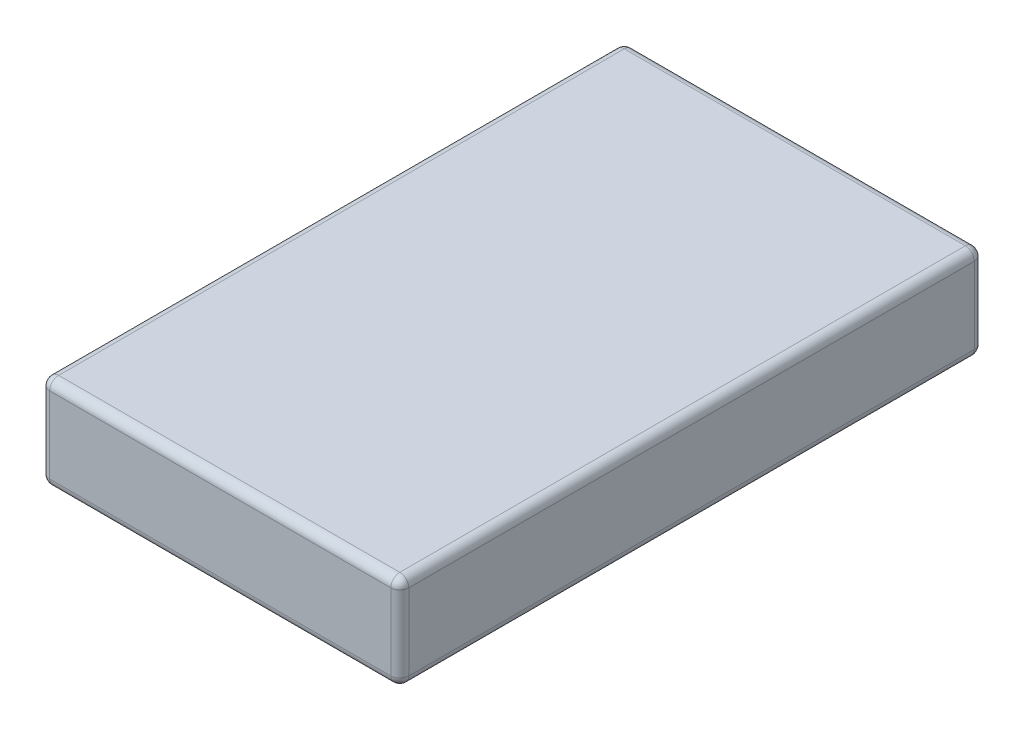
ISO-10303-21;
HEADER;
FILE_DESCRIPTION(('STEP AP214'),'2;1');
FILE_NAME('part.step','',(''),(''),'','','');
FILE_SCHEMA(('AUTOMOTIVE_DESIGN { 1 0 10303 214 1 1 1 1 }'));
ENDSEC;
DATA;
#1=APPLICATION_CONTEXT('core data for automotive mechanical design processes');
#2=APPLICATION_PROTOCOL_DEFINITION('international standard','automotive_design',2000,#1);
#3=PRODUCT_CONTEXT('',#1,'mechanical');
#4=PRODUCT('Part','Part','',(#3));
#5=PRODUCT_RELATED_PRODUCT_CATEGORY('part','',(#4));
#6=PRODUCT_DEFINITION_FORMATION('','',#4);
#7=PRODUCT_DEFINITION_CONTEXT('part definition',#1,'design');
#8=PRODUCT_DEFINITION('design','',#6,#7);
#9=PRODUCT_DEFINITION_SHAPE('','',#8);
#10=(LENGTH_UNIT() NAMED_UNIT(*) SI_UNIT(.MILLI.,.METRE.));
#11=(NAMED_UNIT(*) PLANE_ANGLE_UNIT() SI_UNIT($,.RADIAN.));
#12=(NAMED_UNIT(*) SI_UNIT($,.STERADIAN.) SOLID_ANGLE_UNIT());
#13=UNCERTAINTY_MEASURE_WITH_UNIT(LENGTH_MEASURE(1.E-05),#10,'distance_accuracy_value','');
#14=(GEOMETRIC_REPRESENTATION_CONTEXT(3) GLOBAL_UNCERTAINTY_ASSIGNED_CONTEXT((#13)) GLOBAL_UNIT_ASSIGNED_CONTEXT((#10,
#11,#12)) REPRESENTATION_CONTEXT('',''));
#15=CARTESIAN_POINT('',(0.,0.,0.));
#16=DIRECTION('',(0.,0.,1.));
#17=DIRECTION('',(1.,0.,0.));
#18=AXIS2_PLACEMENT_3D('',#15,#16,#17);
#19=CARTESIAN_POINT('',(1016.,533.4,-1651.));
#20=DIRECTION('',(-1.,0.,0.));
#21=DIRECTION('',(0.,0.,1.));
#22=AXIS2_PLACEMENT_3D('',#19,#20,#21);
#23=PLANE('',#22);
#24=DIRECTION('',(0.,-1.,0.));
#25=VECTOR('',#24,1.);
#26=CARTESIAN_POINT('',(1016.,533.4,1600.2));
#27=LINE('',#26,#25);
#28=CARTESIAN_POINT('',(1016.,482.6,1600.2));
#29=VERTEX_POINT('',#28);
#30=CARTESIAN_POINT('',(1016.,50.8,1600.2));
#31=VERTEX_POINT('',#30);
#32=EDGE_CURVE('E200',#29,#31,#27,.T.);
#33=ORIENTED_EDGE('',*,*,#32,.T.);
#34=DIRECTION('',(0.,0.,-1.));
#35=VECTOR('',#34,1.);
#36=CARTESIAN_POINT('',(1016.,50.8,-1651.));
#37=LINE('',#36,#35);
#38=CARTESIAN_POINT('',(1016.,50.8,-1600.2));
#39=VERTEX_POINT('',#38);
#40=EDGE_CURVE('E207',#31,#39,#37,.T.);
#41=ORIENTED_EDGE('',*,*,#40,.T.);
#42=DIRECTION('',(0.,-1.,0.));
#43=VECTOR('',#42,1.);
#44=CARTESIAN_POINT('',(1016.,533.4,-1600.2));
#45=LINE('',#44,#43);
#46=CARTESIAN_POINT('',(1016.,482.6,-1600.2));
#47=VERTEX_POINT('',#46);
#48=EDGE_CURVE('E203',#39,#47,#45,.F.);
#49=ORIENTED_EDGE('',*,*,#48,.T.);
#50=DIRECTION('',(0.,0.,-1.));
#51=VECTOR('',#50,1.);
#52=CARTESIAN_POINT('',(1016.,482.6,1651.));
#53=LINE('',#52,#51);
#54=EDGE_CURVE('E197',#47,#29,#53,.F.);
#55=ORIENTED_EDGE('',*,*,#54,.T.);
#56=EDGE_LOOP('',(#33,#41,#49,#55));
#57=FACE_BOUND('',#56,.T.);
#58=ADVANCED_FACE('F45',(#57),#23,.F.);
#59=CARTESIAN_POINT('',(-1016.,533.4,-1651.));
#60=DIRECTION('',(0.,0.,1.));
#61=DIRECTION('',(1.,0.,0.));
#62=AXIS2_PLACEMENT_3D('',#59,#60,#61);
#63=PLANE('',#62);
#64=DIRECTION('',(0.,-1.,0.));
#65=VECTOR('',#64,1.);
#66=CARTESIAN_POINT('',(965.2,533.4,-1651.));
#67=LINE('',#66,#65);
#68=CARTESIAN_POINT('',(965.2,482.6,-1651.));
#69=VERTEX_POINT('',#68);
#70=CARTESIAN_POINT('',(965.2,50.8,-1651.));
#71=VERTEX_POINT('',#70);
#72=EDGE_CURVE('E187',#69,#71,#67,.T.);
#73=ORIENTED_EDGE('',*,*,#72,.T.);
#74=DIRECTION('',(-1.,0.,0.));
#75=VECTOR('',#74,1.);
#76=CARTESIAN_POINT('',(-1016.,50.8,-1651.));
#77=LINE('',#76,#75);
#78=CARTESIAN_POINT('',(-965.2,50.8,-1651.));
#79=VERTEX_POINT('',#78);
#80=EDGE_CURVE('E194',#71,#79,#77,.T.);
#81=ORIENTED_EDGE('',*,*,#80,.T.);
#82=DIRECTION('',(0.,-1.,0.));
#83=VECTOR('',#82,1.);
#84=CARTESIAN_POINT('',(-965.2,533.4,-1651.));
#85=LINE('',#84,#83);
#86=CARTESIAN_POINT('',(-965.2,482.6,-1651.));
#87=VERTEX_POINT('',#86);
#88=EDGE_CURVE('E190',#79,#87,#85,.F.);
#89=ORIENTED_EDGE('',*,*,#88,.T.);
#90=DIRECTION('',(-1.,0.,0.));
#91=VECTOR('',#90,1.);
#92=CARTESIAN_POINT('',(1016.,482.6,-1651.));
#93=LINE('',#92,#91);
#94=EDGE_CURVE('E184',#87,#69,#93,.F.);
#95=ORIENTED_EDGE('',*,*,#94,.T.);
#96=EDGE_LOOP('',(#73,#81,#89,#95));
#97=FACE_BOUND('',#96,.T.);
#98=ADVANCED_FACE('F364',(#97),#63,.F.);
#99=CARTESIAN_POINT('',(-1016.,533.4,-1651.));
#100=DIRECTION('',(1.,0.,0.));
#101=DIRECTION('',(0.,0.,-1.));
#102=AXIS2_PLACEMENT_3D('',#99,#100,#101);
#103=PLANE('',#102);
#104=DIRECTION('',(0.,-1.,0.));
#105=VECTOR('',#104,1.);
#106=CARTESIAN_POINT('',(-1016.,533.4,-1600.2));
#107=LINE('',#106,#105);
#108=CARTESIAN_POINT('',(-1016.,482.6,-1600.2));
#109=VERTEX_POINT('',#108);
#110=CARTESIAN_POINT('',(-1016.,50.8,-1600.2));
#111=VERTEX_POINT('',#110);
#112=EDGE_CURVE('E146',#109,#111,#107,.T.);
#113=ORIENTED_EDGE('',*,*,#112,.T.);
#114=DIRECTION('',(0.,0.,1.));
#115=VECTOR('',#114,1.);
#116=CARTESIAN_POINT('',(-1016.,50.8,-1651.));
#117=LINE('',#116,#115);
#118=CARTESIAN_POINT('',(-1016.,50.8,1600.2));
#119=VERTEX_POINT('',#118);
#120=EDGE_CURVE('E141',#111,#119,#117,.T.);
#121=ORIENTED_EDGE('',*,*,#120,.T.);
#122=DIRECTION('',(0.,-1.,0.));
#123=VECTOR('',#122,1.);
#124=CARTESIAN_POINT('',(-1016.,533.4,1600.2));
#125=LINE('',#124,#123);
#126=CARTESIAN_POINT('',(-1016.,482.6,1600.2));
#127=VERTEX_POINT('',#126);
#128=EDGE_CURVE('E133',#119,#127,#125,.F.);
#129=ORIENTED_EDGE('',*,*,#128,.T.);
#130=DIRECTION('',(0.,0.,1.));
#131=VECTOR('',#130,1.);
#132=CARTESIAN_POINT('',(-1016.,482.6,-1651.));
#133=LINE('',#132,#131);
#134=EDGE_CURVE('E138',#127,#109,#133,.F.);
#135=ORIENTED_EDGE('',*,*,#134,.T.);
#136=EDGE_LOOP('',(#113,#121,#129,#135));
#137=FACE_BOUND('',#136,.T.);
#138=ADVANCED_FACE('F136',(#137),#103,.F.);
#139=CARTESIAN_POINT('',(-1016.,533.4,1651.));
#140=DIRECTION('',(0.,0.,-1.));
#141=DIRECTION('',(-1.,0.,0.));
#142=AXIS2_PLACEMENT_3D('',#139,#140,#141);
#143=PLANE('',#142);
#144=DIRECTION('',(0.,-1.,0.));
#145=VECTOR('',#144,1.);
#146=CARTESIAN_POINT('',(-965.2,533.4,1651.));
#147=LINE('',#146,#145);
#148=CARTESIAN_POINT('',(-965.2,482.6,1651.));
#149=VERTEX_POINT('',#148);
#150=CARTESIAN_POINT('',(-965.2,50.8,1651.));
#151=VERTEX_POINT('',#150);
#152=EDGE_CURVE('E154',#149,#151,#147,.T.);
#153=ORIENTED_EDGE('',*,*,#152,.T.);
#154=DIRECTION('',(1.,0.,0.));
#155=VECTOR('',#154,1.);
#156=CARTESIAN_POINT('',(-1016.,50.8,1651.));
#157=LINE('',#156,#155);
#158=CARTESIAN_POINT('',(965.2,50.8,1651.));
#159=VERTEX_POINT('',#158);
#160=EDGE_CURVE('E218',#151,#159,#157,.T.);
#161=ORIENTED_EDGE('',*,*,#160,.T.);
#162=DIRECTION('',(0.,-1.,0.));
#163=VECTOR('',#162,1.);
#164=CARTESIAN_POINT('',(965.2,533.4,1651.));
#165=LINE('',#164,#163);
#166=CARTESIAN_POINT('',(965.2,482.6,1651.));
#167=VERTEX_POINT('',#166);
#168=EDGE_CURVE('E213',#159,#167,#165,.F.);
#169=ORIENTED_EDGE('',*,*,#168,.T.);
#170=DIRECTION('',(1.,0.,0.));
#171=VECTOR('',#170,1.);
#172=CARTESIAN_POINT('',(-1016.,482.6,1651.));
#173=LINE('',#172,#171);
#174=EDGE_CURVE('E210',#167,#149,#173,.F.);
#175=ORIENTED_EDGE('',*,*,#174,.T.);
#176=EDGE_LOOP('',(#153,#161,#169,#175));
#177=FACE_BOUND('',#176,.T.);
#178=ADVANCED_FACE('F355',(#177),#143,.F.);
#179=CARTESIAN_POINT('',(0.,533.4,0.));
#180=DIRECTION('',(0.,1.,0.));
#181=DIRECTION('',(0.,0.,1.));
#182=AXIS2_PLACEMENT_3D('',#179,#180,#181);
#183=PLANE('',#182);
#184=DIRECTION('',(0.,0.,1.));
#185=VECTOR('',#184,1.);
#186=CARTESIAN_POINT('',(-965.2,533.4,1651.));
#187=LINE('',#186,#185);
#188=CARTESIAN_POINT('',(-965.2,533.4,-1600.2));
#189=VERTEX_POINT('',#188);
#190=CARTESIAN_POINT('',(-965.2,533.4,1600.2));
#191=VERTEX_POINT('',#190);
#192=EDGE_CURVE('E55',#189,#191,#187,.T.);
#193=ORIENTED_EDGE('',*,*,#192,.T.);
#194=DIRECTION('',(1.,0.,0.));
#195=VECTOR('',#194,1.);
#196=CARTESIAN_POINT('',(1016.,533.4,1600.2));
#197=LINE('',#196,#195);
#198=CARTESIAN_POINT('',(965.2,533.4,1600.2));
#199=VERTEX_POINT('',#198);
#200=EDGE_CURVE('E11',#191,#199,#197,.T.);
#201=ORIENTED_EDGE('',*,*,#200,.T.);
#202=DIRECTION('',(0.,0.,-1.));
#203=VECTOR('',#202,1.);
#204=CARTESIAN_POINT('',(965.2,533.4,-1651.));
#205=LINE('',#204,#203);
#206=CARTESIAN_POINT('',(965.2,533.4,-1600.2));
#207=VERTEX_POINT('',#206);
#208=EDGE_CURVE('E234',#199,#207,#205,.T.);
#209=ORIENTED_EDGE('',*,*,#208,.T.);
#210=DIRECTION('',(-1.,0.,0.));
#211=VECTOR('',#210,1.);
#212=CARTESIAN_POINT('',(-1016.,533.4,-1600.2));
#213=LINE('',#212,#211);
#214=EDGE_CURVE('E66',#207,#189,#213,.T.);
#215=ORIENTED_EDGE('',*,*,#214,.T.);
#216=EDGE_LOOP('',(#193,#201,#209,#215));
#217=FACE_BOUND('',#216,.T.);
#218=ADVANCED_FACE('F357',(#217),#183,.T.);
#219=CARTESIAN_POINT('',(0.,0.,0.));
#220=DIRECTION('',(0.,1.,0.));
#221=DIRECTION('',(0.,0.,1.));
#222=AXIS2_PLACEMENT_3D('',#219,#220,#221);
#223=PLANE('',#222);
#224=DIRECTION('',(0.,0.,1.));
#225=VECTOR('',#224,1.);
#226=CARTESIAN_POINT('',(-965.2,0.,1.29810692110018E-13));
#227=LINE('',#226,#225);
#228=CARTESIAN_POINT('',(-965.2,0.,1600.2));
#229=VERTEX_POINT('',#228);
#230=CARTESIAN_POINT('',(-965.2,0.,-1600.2));
#231=VERTEX_POINT('',#230);
#232=EDGE_CURVE('E227',#229,#231,#227,.F.);
#233=ORIENTED_EDGE('',*,*,#232,.T.);
#234=DIRECTION('',(-1.,0.,0.));
#235=VECTOR('',#234,1.);
#236=CARTESIAN_POINT('',(0.,0.,-1600.2));
#237=LINE('',#236,#235);
#238=CARTESIAN_POINT('',(965.2,0.,-1600.2));
#239=VERTEX_POINT('',#238);
#240=EDGE_CURVE('E230',#231,#239,#237,.F.);
#241=ORIENTED_EDGE('',*,*,#240,.T.);
#242=DIRECTION('',(0.,0.,-1.));
#243=VECTOR('',#242,1.);
#244=CARTESIAN_POINT('',(965.2,0.,-1.29810692110018E-13));
#245=LINE('',#244,#243);
#246=CARTESIAN_POINT('',(965.2,0.,1600.2));
#247=VERTEX_POINT('',#246);
#248=EDGE_CURVE('E221',#239,#247,#245,.F.);
#249=ORIENTED_EDGE('',*,*,#248,.T.);
#250=DIRECTION('',(1.,0.,0.));
#251=VECTOR('',#250,1.);
#252=CARTESIAN_POINT('',(0.,0.,1600.2));
#253=LINE('',#252,#251);
#254=EDGE_CURVE('E224',#247,#229,#253,.F.);
#255=ORIENTED_EDGE('',*,*,#254,.T.);
#256=EDGE_LOOP('',(#233,#241,#249,#255));
#257=FACE_BOUND('',#256,.T.);
#258=ADVANCED_FACE('F325',(#257),#223,.F.);
#259=CARTESIAN_POINT('',(965.2,533.4,1600.2));
#260=DIRECTION('',(0.,-1.,0.));
#261=DIRECTION('',(0.,0.,-1.));
#262=AXIS2_PLACEMENT_3D('',#259,#260,#261);
#263=CYLINDRICAL_SURFACE('',#262,50.8);
#264=CARTESIAN_POINT('',(965.2,482.6,1600.2));
#265=DIRECTION('',(0.,1.,0.));
#266=DIRECTION('',(0.,0.,1.));
#267=AXIS2_PLACEMENT_3D('',#264,#265,#266);
#268=CIRCLE('',#267,50.8);
#269=EDGE_CURVE('E49',#167,#29,#268,.T.);
#270=ORIENTED_EDGE('',*,*,#269,.F.);
#271=ORIENTED_EDGE('',*,*,#168,.F.);
#272=CARTESIAN_POINT('',(965.2,50.8,1600.2));
#273=DIRECTION('',(0.,-1.,0.));
#274=DIRECTION('',(0.,0.,-1.));
#275=AXIS2_PLACEMENT_3D('',#272,#273,#274);
#276=CIRCLE('',#275,50.8);
#277=EDGE_CURVE('E178',#31,#159,#276,.T.);
#278=ORIENTED_EDGE('',*,*,#277,.F.);
#279=ORIENTED_EDGE('',*,*,#32,.F.);
#280=EDGE_LOOP('',(#270,#271,#278,#279));
#281=FACE_BOUND('',#280,.T.);
#282=ADVANCED_FACE('F47',(#281),#263,.T.);
#283=CARTESIAN_POINT('',(965.2,482.6,1600.2));
#284=DIRECTION('',(1.,0.,0.));
#285=DIRECTION('',(0.,0.,-1.));
#286=AXIS2_PLACEMENT_3D('',#283,#284,#285);
#287=SPHERICAL_SURFACE('',#286,50.8);
#288=CARTESIAN_POINT('',(965.2,482.6,1600.2));
#289=DIRECTION('',(1.,0.,0.));
#290=DIRECTION('',(0.,0.,-1.));
#291=AXIS2_PLACEMENT_3D('',#288,#289,#290);
#292=CIRCLE('',#291,50.8);
#293=EDGE_CURVE('E300',#167,#199,#292,.F.);
#294=ORIENTED_EDGE('',*,*,#293,.F.);
#295=ORIENTED_EDGE('',*,*,#269,.T.);
#296=CARTESIAN_POINT('',(965.2,482.6,1600.2));
#297=DIRECTION('',(0.,0.,1.));
#298=DIRECTION('',(0.,-1.,0.));
#299=AXIS2_PLACEMENT_3D('',#296,#297,#298);
#300=CIRCLE('',#299,50.8);
#301=EDGE_CURVE('E304',#199,#29,#300,.F.);
#302=ORIENTED_EDGE('',*,*,#301,.F.);
#303=EDGE_LOOP('',(#294,#295,#302));
#304=FACE_BOUND('',#303,.T.);
#305=ADVANCED_FACE('F350',(#304),#287,.T.);
#306=CARTESIAN_POINT('',(965.2,50.8,1600.2));
#307=DIRECTION('',(0.,0.,1.));
#308=DIRECTION('',(0.,-1.,0.));
#309=AXIS2_PLACEMENT_3D('',#306,#307,#308);
#310=SPHERICAL_SURFACE('',#309,50.8);
#311=CARTESIAN_POINT('',(965.2,50.8,1600.2));
#312=DIRECTION('',(0.,0.,1.));
#313=DIRECTION('',(1.,0.,0.));
#314=AXIS2_PLACEMENT_3D('',#311,#312,#313);
#315=CIRCLE('',#314,50.8);
#316=EDGE_CURVE('E292',#31,#247,#315,.F.);
#317=ORIENTED_EDGE('',*,*,#316,.F.);
#318=ORIENTED_EDGE('',*,*,#277,.T.);
#319=CARTESIAN_POINT('',(965.2,50.8,1600.2));
#320=DIRECTION('',(1.,0.,0.));
#321=DIRECTION('',(0.,0.,-1.));
#322=AXIS2_PLACEMENT_3D('',#319,#320,#321);
#323=CIRCLE('',#322,50.8);
#324=EDGE_CURVE('E296',#247,#159,#323,.F.);
#325=ORIENTED_EDGE('',*,*,#324,.F.);
#326=EDGE_LOOP('',(#317,#318,#325));
#327=FACE_BOUND('',#326,.T.);
#328=ADVANCED_FACE('F313',(#327),#310,.T.);
#329=CARTESIAN_POINT('',(965.2,482.6,-1.29810692110018E-13));
#330=DIRECTION('',(0.,0.,1.));
#331=DIRECTION('',(1.,0.,0.));
#332=AXIS2_PLACEMENT_3D('',#329,#330,#331);
#333=CYLINDRICAL_SURFACE('',#332,50.8);
#334=ORIENTED_EDGE('',*,*,#301,.T.);
#335=ORIENTED_EDGE('',*,*,#54,.F.);
#336=CARTESIAN_POINT('',(965.2,482.6,-1600.2));
#337=DIRECTION('',(0.,0.,-1.));
#338=DIRECTION('',(-1.,0.,0.));
#339=AXIS2_PLACEMENT_3D('',#336,#337,#338);
#340=CIRCLE('',#339,50.8);
#341=EDGE_CURVE('E285',#207,#47,#340,.T.);
#342=ORIENTED_EDGE('',*,*,#341,.F.);
#343=ORIENTED_EDGE('',*,*,#208,.F.);
#344=EDGE_LOOP('',(#334,#335,#342,#343));
#345=FACE_BOUND('',#344,.T.);
#346=ADVANCED_FACE('F345',(#345),#333,.T.);
#347=CARTESIAN_POINT('',(0.,482.6,1600.2));
#348=DIRECTION('',(-1.,0.,0.));
#349=DIRECTION('',(0.,0.,1.));
#350=AXIS2_PLACEMENT_3D('',#347,#348,#349);
#351=CYLINDRICAL_SURFACE('',#350,50.8);
#352=ORIENTED_EDGE('',*,*,#293,.T.);
#353=ORIENTED_EDGE('',*,*,#200,.F.);
#354=CARTESIAN_POINT('',(-965.2,482.6,1600.2));
#355=DIRECTION('',(-1.,0.,0.));
#356=DIRECTION('',(0.,0.,1.));
#357=AXIS2_PLACEMENT_3D('',#354,#355,#356);
#358=CIRCLE('',#357,50.8);
#359=EDGE_CURVE('E159',#149,#191,#358,.T.);
#360=ORIENTED_EDGE('',*,*,#359,.F.);
#361=ORIENTED_EDGE('',*,*,#174,.F.);
#362=EDGE_LOOP('',(#352,#353,#360,#361));
#363=FACE_BOUND('',#362,.T.);
#364=ADVANCED_FACE('F353',(#363),#351,.T.);
#365=CARTESIAN_POINT('',(-965.2,533.4,1600.2));
#366=DIRECTION('',(0.,-1.,0.));
#367=DIRECTION('',(0.,0.,-1.));
#368=AXIS2_PLACEMENT_3D('',#365,#366,#367);
#369=CYLINDRICAL_SURFACE('',#368,50.8);
#370=CARTESIAN_POINT('',(-965.2,50.8,1600.2));
#371=DIRECTION('',(0.,-1.,0.));
#372=DIRECTION('',(0.,0.,-1.));
#373=AXIS2_PLACEMENT_3D('',#370,#371,#372);
#374=CIRCLE('',#373,50.8);
#375=EDGE_CURVE('E160',#151,#119,#374,.T.);
#376=ORIENTED_EDGE('',*,*,#375,.F.);
#377=ORIENTED_EDGE('',*,*,#152,.F.);
#378=CARTESIAN_POINT('',(-965.2,482.6,1600.2));
#379=DIRECTION('',(0.,1.,0.));
#380=DIRECTION('',(0.,0.,1.));
#381=AXIS2_PLACEMENT_3D('',#378,#379,#380);
#382=CIRCLE('',#381,50.8);
#383=EDGE_CURVE('E150',#127,#149,#382,.T.);
#384=ORIENTED_EDGE('',*,*,#383,.F.);
#385=ORIENTED_EDGE('',*,*,#128,.F.);
#386=EDGE_LOOP('',(#376,#377,#384,#385));
#387=FACE_BOUND('',#386,.T.);
#388=ADVANCED_FACE('F152',(#387),#369,.T.);
#389=CARTESIAN_POINT('',(-1016.,50.8,1600.2));
#390=DIRECTION('',(1.,0.,0.));
#391=DIRECTION('',(0.,0.,-1.));
#392=AXIS2_PLACEMENT_3D('',#389,#390,#391);
#393=CYLINDRICAL_SURFACE('',#392,50.8);
#394=ORIENTED_EDGE('',*,*,#324,.T.);
#395=ORIENTED_EDGE('',*,*,#160,.F.);
#396=CARTESIAN_POINT('',(-965.2,50.8,1600.2));
#397=DIRECTION('',(-1.,0.,0.));
#398=DIRECTION('',(0.,0.,1.));
#399=AXIS2_PLACEMENT_3D('',#396,#397,#398);
#400=CIRCLE('',#399,50.8);
#401=EDGE_CURVE('E278',#229,#151,#400,.T.);
#402=ORIENTED_EDGE('',*,*,#401,.F.);
#403=ORIENTED_EDGE('',*,*,#254,.F.);
#404=EDGE_LOOP('',(#394,#395,#402,#403));
#405=FACE_BOUND('',#404,.T.);
#406=ADVANCED_FACE('F321',(#405),#393,.T.);
#407=CARTESIAN_POINT('',(965.2,50.8,-1651.));
#408=DIRECTION('',(0.,0.,-1.));
#409=DIRECTION('',(-1.,0.,0.));
#410=AXIS2_PLACEMENT_3D('',#407,#408,#409);
#411=CYLINDRICAL_SURFACE('',#410,50.8);
#412=ORIENTED_EDGE('',*,*,#316,.T.);
#413=ORIENTED_EDGE('',*,*,#248,.F.);
#414=CARTESIAN_POINT('',(965.2,50.8,-1600.2));
#415=DIRECTION('',(0.,0.,-1.));
#416=DIRECTION('',(-1.,0.,0.));
#417=AXIS2_PLACEMENT_3D('',#414,#415,#416);
#418=CIRCLE('',#417,50.8);
#419=EDGE_CURVE('E274',#39,#239,#418,.T.);
#420=ORIENTED_EDGE('',*,*,#419,.F.);
#421=ORIENTED_EDGE('',*,*,#40,.F.);
#422=EDGE_LOOP('',(#412,#413,#420,#421));
#423=FACE_BOUND('',#422,.T.);
#424=ADVANCED_FACE('F331',(#423),#411,.T.);
#425=CARTESIAN_POINT('',(965.2,533.4,-1600.2));
#426=DIRECTION('',(0.,-1.,0.));
#427=DIRECTION('',(0.,0.,-1.));
#428=AXIS2_PLACEMENT_3D('',#425,#426,#427);
#429=CYLINDRICAL_SURFACE('',#428,50.8);
#430=CARTESIAN_POINT('',(965.2,482.6,-1600.2));
#431=DIRECTION('',(0.,1.,0.));
#432=DIRECTION('',(0.,0.,1.));
#433=AXIS2_PLACEMENT_3D('',#430,#431,#432);
#434=CIRCLE('',#433,50.8);
#435=EDGE_CURVE('E288',#47,#69,#434,.T.);
#436=ORIENTED_EDGE('',*,*,#435,.F.);
#437=ORIENTED_EDGE('',*,*,#48,.F.);
#438=CARTESIAN_POINT('',(965.2,50.8,-1600.2));
#439=DIRECTION('',(0.,-1.,0.));
#440=DIRECTION('',(0.,0.,-1.));
#441=AXIS2_PLACEMENT_3D('',#438,#439,#440);
#442=CIRCLE('',#441,50.8);
#443=EDGE_CURVE('E270',#71,#39,#442,.T.);
#444=ORIENTED_EDGE('',*,*,#443,.F.);
#445=ORIENTED_EDGE('',*,*,#72,.F.);
#446=EDGE_LOOP('',(#436,#437,#444,#445));
#447=FACE_BOUND('',#446,.T.);
#448=ADVANCED_FACE('F337',(#447),#429,.T.);
#449=CARTESIAN_POINT('',(965.2,482.6,-1600.2));
#450=DIRECTION('',(1.,0.,0.));
#451=DIRECTION('',(0.,0.,-1.));
#452=AXIS2_PLACEMENT_3D('',#449,#450,#451);
#453=SPHERICAL_SURFACE('',#452,50.8);
#454=ORIENTED_EDGE('',*,*,#341,.T.);
#455=ORIENTED_EDGE('',*,*,#435,.T.);
#456=CARTESIAN_POINT('',(965.2,482.6,-1600.2));
#457=DIRECTION('',(1.,0.,0.));
#458=DIRECTION('',(0.,0.,-1.));
#459=AXIS2_PLACEMENT_3D('',#456,#457,#458);
#460=CIRCLE('',#459,50.8);
#461=EDGE_CURVE('E167',#207,#69,#460,.F.);
#462=ORIENTED_EDGE('',*,*,#461,.F.);
#463=EDGE_LOOP('',(#454,#455,#462));
#464=FACE_BOUND('',#463,.T.);
#465=ADVANCED_FACE('F411',(#464),#453,.T.);
#466=CARTESIAN_POINT('',(-965.2,482.6,1600.2));
#467=DIRECTION('',(0.,0.,1.));
#468=DIRECTION('',(1.,0.,0.));
#469=AXIS2_PLACEMENT_3D('',#466,#467,#468);
#470=SPHERICAL_SURFACE('',#469,50.8);
#471=ORIENTED_EDGE('',*,*,#383,.T.);
#472=ORIENTED_EDGE('',*,*,#359,.T.);
#473=CARTESIAN_POINT('',(-965.2,482.6,1600.2));
#474=DIRECTION('',(0.,0.,1.));
#475=DIRECTION('',(1.,0.,0.));
#476=AXIS2_PLACEMENT_3D('',#473,#474,#475);
#477=CIRCLE('',#476,50.8);
#478=EDGE_CURVE('E163',#127,#191,#477,.F.);
#479=ORIENTED_EDGE('',*,*,#478,.F.);
#480=EDGE_LOOP('',(#471,#472,#479));
#481=FACE_BOUND('',#480,.T.);
#482=ADVANCED_FACE('F164',(#481),#470,.T.);
#483=CARTESIAN_POINT('',(-965.2,50.8,1600.2));
#484=DIRECTION('',(0.,0.,1.));
#485=DIRECTION('',(0.,-1.,0.));
#486=AXIS2_PLACEMENT_3D('',#483,#484,#485);
#487=SPHERICAL_SURFACE('',#486,50.8);
#488=ORIENTED_EDGE('',*,*,#401,.T.);
#489=ORIENTED_EDGE('',*,*,#375,.T.);
#490=CARTESIAN_POINT('',(-965.2,50.8,1600.2));
#491=DIRECTION('',(0.,0.,1.));
#492=DIRECTION('',(1.,0.,0.));
#493=AXIS2_PLACEMENT_3D('',#490,#491,#492);
#494=CIRCLE('',#493,50.8);
#495=EDGE_CURVE('E168',#229,#119,#494,.F.);
#496=ORIENTED_EDGE('',*,*,#495,.F.);
#497=EDGE_LOOP('',(#488,#489,#496));
#498=FACE_BOUND('',#497,.T.);
#499=ADVANCED_FACE('F404',(#498),#487,.T.);
#500=CARTESIAN_POINT('',(965.2,50.8,-1600.2));
#501=DIRECTION('',(1.,0.,0.));
#502=DIRECTION('',(0.,1.,0.));
#503=AXIS2_PLACEMENT_3D('',#500,#501,#502);
#504=SPHERICAL_SURFACE('',#503,50.8);
#505=ORIENTED_EDGE('',*,*,#443,.T.);
#506=ORIENTED_EDGE('',*,*,#419,.T.);
#507=CARTESIAN_POINT('',(965.2,50.8,-1600.2));
#508=DIRECTION('',(1.,0.,0.));
#509=DIRECTION('',(0.,0.,-1.));
#510=AXIS2_PLACEMENT_3D('',#507,#508,#509);
#511=CIRCLE('',#510,50.8);
#512=EDGE_CURVE('E261',#71,#239,#511,.F.);
#513=ORIENTED_EDGE('',*,*,#512,.F.);
#514=EDGE_LOOP('',(#505,#506,#513));
#515=FACE_BOUND('',#514,.T.);
#516=ADVANCED_FACE('F400',(#515),#504,.T.);
#517=CARTESIAN_POINT('',(0.,482.6,-1600.2));
#518=DIRECTION('',(1.,0.,0.));
#519=DIRECTION('',(0.,0.,-1.));
#520=AXIS2_PLACEMENT_3D('',#517,#518,#519);
#521=CYLINDRICAL_SURFACE('',#520,50.8);
#522=ORIENTED_EDGE('',*,*,#461,.T.);
#523=ORIENTED_EDGE('',*,*,#94,.F.);
#524=CARTESIAN_POINT('',(-965.2,482.6,-1600.2));
#525=DIRECTION('',(-1.,0.,0.));
#526=DIRECTION('',(0.,0.,1.));
#527=AXIS2_PLACEMENT_3D('',#524,#525,#526);
#528=CIRCLE('',#527,50.8);
#529=EDGE_CURVE('E257',#189,#87,#528,.T.);
#530=ORIENTED_EDGE('',*,*,#529,.F.);
#531=ORIENTED_EDGE('',*,*,#214,.F.);
#532=EDGE_LOOP('',(#522,#523,#530,#531));
#533=FACE_BOUND('',#532,.T.);
#534=ADVANCED_FACE('F397',(#533),#521,.T.);
#535=CARTESIAN_POINT('',(-965.2,482.6,1.29810692110018E-13));
#536=DIRECTION('',(0.,0.,-1.));
#537=DIRECTION('',(-1.,0.,0.));
#538=AXIS2_PLACEMENT_3D('',#535,#536,#537);
#539=CYLINDRICAL_SURFACE('',#538,50.8);
#540=ORIENTED_EDGE('',*,*,#478,.T.);
#541=ORIENTED_EDGE('',*,*,#192,.F.);
#542=CARTESIAN_POINT('',(-965.2,482.6,-1600.2));
#543=DIRECTION('',(0.,0.,-1.));
#544=DIRECTION('',(-1.,0.,0.));
#545=AXIS2_PLACEMENT_3D('',#542,#543,#544);
#546=CIRCLE('',#545,50.8);
#547=EDGE_CURVE('E172',#109,#189,#546,.T.);
#548=ORIENTED_EDGE('',*,*,#547,.F.);
#549=ORIENTED_EDGE('',*,*,#134,.F.);
#550=EDGE_LOOP('',(#540,#541,#548,#549));
#551=FACE_BOUND('',#550,.T.);
#552=ADVANCED_FACE('F170',(#551),#539,.T.);
#553=CARTESIAN_POINT('',(-965.2,50.8,-1651.));
#554=DIRECTION('',(0.,0.,1.));
#555=DIRECTION('',(1.,0.,0.));
#556=AXIS2_PLACEMENT_3D('',#553,#554,#555);
#557=CYLINDRICAL_SURFACE('',#556,50.8);
#558=ORIENTED_EDGE('',*,*,#495,.T.);
#559=ORIENTED_EDGE('',*,*,#120,.F.);
#560=CARTESIAN_POINT('',(-965.2,50.8,-1600.2));
#561=DIRECTION('',(0.,0.,-1.));
#562=DIRECTION('',(-1.,0.,0.));
#563=AXIS2_PLACEMENT_3D('',#560,#561,#562);
#564=CIRCLE('',#563,50.8);
#565=EDGE_CURVE('E251',#231,#111,#564,.T.);
#566=ORIENTED_EDGE('',*,*,#565,.F.);
#567=ORIENTED_EDGE('',*,*,#232,.F.);
#568=EDGE_LOOP('',(#558,#559,#566,#567));
#569=FACE_BOUND('',#568,.T.);
#570=ADVANCED_FACE('F390',(#569),#557,.T.);
#571=CARTESIAN_POINT('',(-1016.,50.8,-1600.2));
#572=DIRECTION('',(-1.,0.,0.));
#573=DIRECTION('',(0.,0.,1.));
#574=AXIS2_PLACEMENT_3D('',#571,#572,#573);
#575=CYLINDRICAL_SURFACE('',#574,50.8);
#576=ORIENTED_EDGE('',*,*,#512,.T.);
#577=ORIENTED_EDGE('',*,*,#240,.F.);
#578=CARTESIAN_POINT('',(-965.2,50.8,-1600.2));
#579=DIRECTION('',(-1.,0.,0.));
#580=DIRECTION('',(0.,0.,1.));
#581=AXIS2_PLACEMENT_3D('',#578,#579,#580);
#582=CIRCLE('',#581,50.8);
#583=EDGE_CURVE('E247',#79,#231,#582,.T.);
#584=ORIENTED_EDGE('',*,*,#583,.F.);
#585=ORIENTED_EDGE('',*,*,#80,.F.);
#586=EDGE_LOOP('',(#576,#577,#584,#585));
#587=FACE_BOUND('',#586,.T.);
#588=ADVANCED_FACE('F386',(#587),#575,.T.);
#589=CARTESIAN_POINT('',(-965.2,482.6,-1600.2));
#590=DIRECTION('',(0.,1.,0.));
#591=DIRECTION('',(0.,0.,1.));
#592=AXIS2_PLACEMENT_3D('',#589,#590,#591);
#593=SPHERICAL_SURFACE('',#592,50.8);
#594=ORIENTED_EDGE('',*,*,#547,.T.);
#595=ORIENTED_EDGE('',*,*,#529,.T.);
#596=CARTESIAN_POINT('',(-965.2,482.6,-1600.2));
#597=DIRECTION('',(0.,1.,0.));
#598=DIRECTION('',(0.,0.,1.));
#599=AXIS2_PLACEMENT_3D('',#596,#597,#598);
#600=CIRCLE('',#599,50.8);
#601=EDGE_CURVE('E244',#109,#87,#600,.F.);
#602=ORIENTED_EDGE('',*,*,#601,.F.);
#603=EDGE_LOOP('',(#594,#595,#602));
#604=FACE_BOUND('',#603,.T.);
#605=ADVANCED_FACE('F382',(#604),#593,.T.);
#606=CARTESIAN_POINT('',(-965.2,50.8,-1600.2));
#607=DIRECTION('',(0.,-1.,0.));
#608=DIRECTION('',(0.,0.,-1.));
#609=AXIS2_PLACEMENT_3D('',#606,#607,#608);
#610=SPHERICAL_SURFACE('',#609,50.8);
#611=ORIENTED_EDGE('',*,*,#583,.T.);
#612=ORIENTED_EDGE('',*,*,#565,.T.);
#613=CARTESIAN_POINT('',(-965.2,50.8,-1600.2));
#614=DIRECTION('',(0.,-1.,0.));
#615=DIRECTION('',(0.,0.,-1.));
#616=AXIS2_PLACEMENT_3D('',#613,#614,#615);
#617=CIRCLE('',#616,50.8);
#618=EDGE_CURVE('E241',#79,#111,#617,.F.);
#619=ORIENTED_EDGE('',*,*,#618,.F.);
#620=EDGE_LOOP('',(#611,#612,#619));
#621=FACE_BOUND('',#620,.T.);
#622=ADVANCED_FACE('F378',(#621),#610,.T.);
#623=CARTESIAN_POINT('',(-965.2,533.4,-1600.2));
#624=DIRECTION('',(0.,-1.,0.));
#625=DIRECTION('',(0.,0.,-1.));
#626=AXIS2_PLACEMENT_3D('',#623,#624,#625);
#627=CYLINDRICAL_SURFACE('',#626,50.8);
#628=ORIENTED_EDGE('',*,*,#601,.T.);
#629=ORIENTED_EDGE('',*,*,#88,.F.);
#630=ORIENTED_EDGE('',*,*,#618,.T.);
#631=ORIENTED_EDGE('',*,*,#112,.F.);
#632=EDGE_LOOP('',(#628,#629,#630,#631));
#633=FACE_BOUND('',#632,.T.);
#634=ADVANCED_FACE('F375',(#633),#627,.T.);
#635=CLOSED_SHELL('',(#58,#98,#138,#178,#218,#258,#282,#305,#328,#346,#364,#388,#406,#424,#448,
#465,#482,#499,#516,#534,#552,#570,#588,#605,#622,#634));
#636=MANIFOLD_SOLID_BREP('B2',#635);
#637=ADVANCED_BREP_SHAPE_REPRESENTATION('',(#18,#636),#14);
#638=SHAPE_DEFINITION_REPRESENTATION(#9,#637);
ENDSEC;
END-ISO-10303-21;
